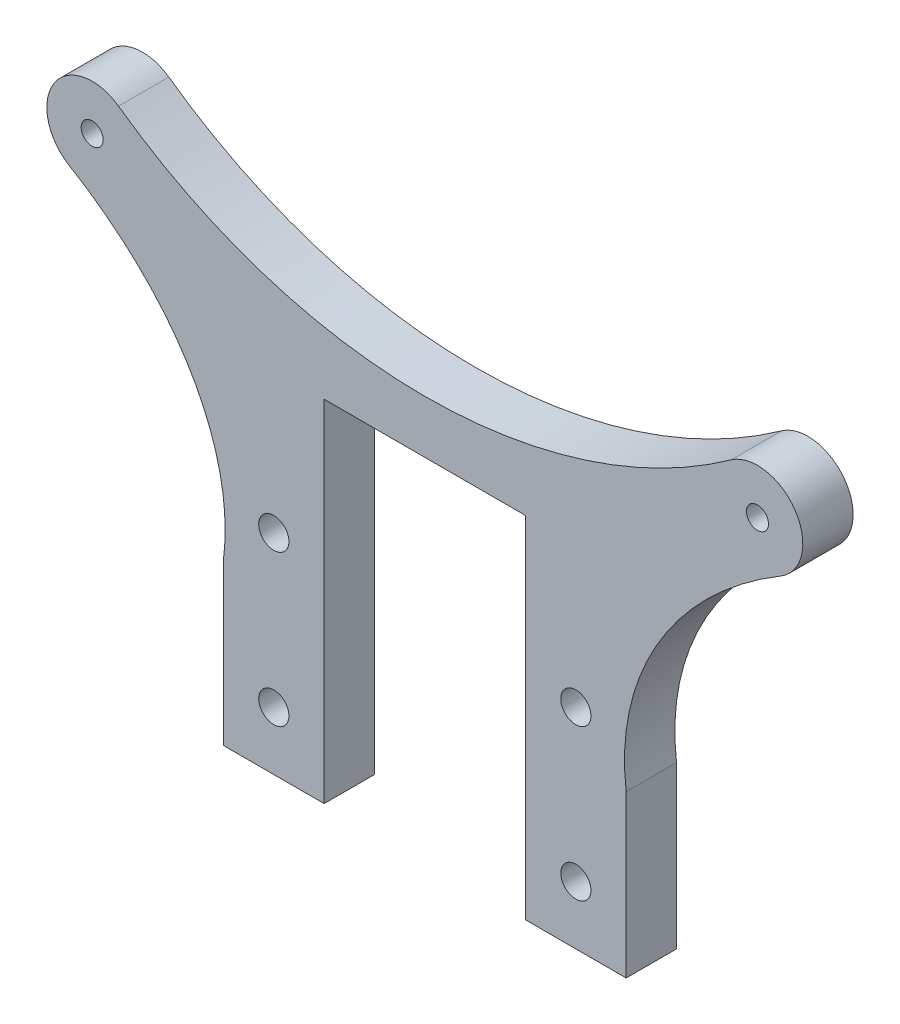
ISO-10303-21;
HEADER;
FILE_DESCRIPTION(('STEP AP214'),'2;1');
FILE_NAME('part.step','',(''),(''),'','','');
FILE_SCHEMA(('AUTOMOTIVE_DESIGN { 1 0 10303 214 1 1 1 1 }'));
ENDSEC;
DATA;
#1=APPLICATION_CONTEXT('core data for automotive mechanical design processes');
#2=APPLICATION_PROTOCOL_DEFINITION('international standard','automotive_design',2000,#1);
#3=PRODUCT_CONTEXT('',#1,'mechanical');
#4=PRODUCT('Part','Part','',(#3));
#5=PRODUCT_RELATED_PRODUCT_CATEGORY('part','',(#4));
#6=PRODUCT_DEFINITION_FORMATION('','',#4);
#7=PRODUCT_DEFINITION_CONTEXT('part definition',#1,'design');
#8=PRODUCT_DEFINITION('design','',#6,#7);
#9=PRODUCT_DEFINITION_SHAPE('','',#8);
#10=(LENGTH_UNIT() NAMED_UNIT(*) SI_UNIT(.MILLI.,.METRE.));
#11=(NAMED_UNIT(*) PLANE_ANGLE_UNIT() SI_UNIT($,.RADIAN.));
#12=(NAMED_UNIT(*) SI_UNIT($,.STERADIAN.) SOLID_ANGLE_UNIT());
#13=UNCERTAINTY_MEASURE_WITH_UNIT(LENGTH_MEASURE(1.E-05),#10,'distance_accuracy_value','');
#14=(GEOMETRIC_REPRESENTATION_CONTEXT(3) GLOBAL_UNCERTAINTY_ASSIGNED_CONTEXT((#13)) GLOBAL_UNIT_ASSIGNED_CONTEXT((#10,
#11,#12)) REPRESENTATION_CONTEXT('',''));
#15=CARTESIAN_POINT('',(0.,0.,0.));
#16=DIRECTION('',(0.,0.,1.));
#17=DIRECTION('',(1.,0.,0.));
#18=AXIS2_PLACEMENT_3D('',#15,#16,#17);
#19=CARTESIAN_POINT('',(-73.0062863667231,-17.7906023746381,6.35));
#20=DIRECTION('',(0.,0.,-1.));
#21=DIRECTION('',(-1.,0.,0.));
#22=AXIS2_PLACEMENT_3D('',#19,#20,#21);
#23=PLANE('',#22);
#24=CARTESIAN_POINT('',(19.05,-36.83,6.35));
#25=DIRECTION('',(0.,0.,1.));
#26=DIRECTION('',(-1.,0.,0.));
#27=AXIS2_PLACEMENT_3D('',#24,#25,#26);
#28=CIRCLE('',#27,1.905);
#29=CARTESIAN_POINT('',(17.145,-36.83,6.35));
#30=VERTEX_POINT('',#29);
#31=EDGE_CURVE('E314',#30,#30,#28,.T.);
#32=ORIENTED_EDGE('',*,*,#31,.F.);
#33=EDGE_LOOP('',(#32));
#34=FACE_BOUND('',#33,.T.);
#35=CARTESIAN_POINT('',(-19.05,-17.78,6.35));
#36=DIRECTION('',(0.,0.,1.));
#37=DIRECTION('',(1.,0.,0.));
#38=AXIS2_PLACEMENT_3D('',#35,#36,#37);
#39=CIRCLE('',#38,1.905);
#40=CARTESIAN_POINT('',(-17.145,-17.78,6.35));
#41=VERTEX_POINT('',#40);
#42=EDGE_CURVE('E302',#41,#41,#39,.T.);
#43=ORIENTED_EDGE('',*,*,#42,.F.);
#44=EDGE_LOOP('',(#43));
#45=FACE_BOUND('',#44,.T.);
#46=CARTESIAN_POINT('',(-41.9643005243721,14.3937584378365,6.35));
#47=DIRECTION('',(0.,0.,1.));
#48=DIRECTION('',(1.,0.,0.));
#49=AXIS2_PLACEMENT_3D('',#46,#47,#48);
#50=CIRCLE('',#49,1.3890625);
#51=CARTESIAN_POINT('',(-40.5752380243721,14.3937584378365,6.35));
#52=VERTEX_POINT('',#51);
#53=EDGE_CURVE('E158',#52,#52,#50,.T.);
#54=ORIENTED_EDGE('',*,*,#53,.F.);
#55=EDGE_LOOP('',(#54));
#56=FACE_BOUND('',#55,.T.);
#57=DIRECTION('',(0.,1.,0.));
#58=VECTOR('',#57,1.);
#59=CARTESIAN_POINT('',(-12.7,0.,6.35));
#60=LINE('',#59,#58);
#61=CARTESIAN_POINT('',(-12.7,-44.1799362896269,6.35));
#62=VERTEX_POINT('',#61);
#63=CARTESIAN_POINT('',(-12.7,0.,6.35));
#64=VERTEX_POINT('',#63);
#65=EDGE_CURVE('E177',#62,#64,#60,.T.);
#66=ORIENTED_EDGE('',*,*,#65,.T.);
#67=DIRECTION('',(1.,0.,0.));
#68=VECTOR('',#67,1.);
#69=CARTESIAN_POINT('',(-12.7,0.,6.35));
#70=LINE('',#69,#68);
#71=CARTESIAN_POINT('',(12.7,0.,6.35));
#72=VERTEX_POINT('',#71);
#73=EDGE_CURVE('E104',#64,#72,#70,.T.);
#74=ORIENTED_EDGE('',*,*,#73,.T.);
#75=DIRECTION('',(0.,-1.,0.));
#76=VECTOR('',#75,1.);
#77=CARTESIAN_POINT('',(12.7,0.,6.35));
#78=LINE('',#77,#76);
#79=CARTESIAN_POINT('',(12.7,-44.1799362896269,6.35));
#80=VERTEX_POINT('',#79);
#81=EDGE_CURVE('E204',#72,#80,#78,.T.);
#82=ORIENTED_EDGE('',*,*,#81,.T.);
#83=DIRECTION('',(1.,0.,0.));
#84=VECTOR('',#83,1.);
#85=CARTESIAN_POINT('',(25.4,-44.1799362896269,6.35));
#86=LINE('',#85,#84);
#87=CARTESIAN_POINT('',(25.4,-44.1799362896269,6.35));
#88=VERTEX_POINT('',#87);
#89=EDGE_CURVE('E223',#80,#88,#86,.T.);
#90=ORIENTED_EDGE('',*,*,#89,.T.);
#91=DIRECTION('',(0.,1.,0.));
#92=VECTOR('',#91,1.);
#93=CARTESIAN_POINT('',(25.3999999999999,-23.8229548190026,6.35));
#94=LINE('',#93,#92);
#95=CARTESIAN_POINT('',(25.3999999999999,-23.8229548190026,6.35));
#96=VERTEX_POINT('',#95);
#97=EDGE_CURVE('E220',#88,#96,#94,.T.);
#98=ORIENTED_EDGE('',*,*,#97,.T.);
#99=CARTESIAN_POINT('',(73.0062863667231,-17.7906023746381,6.35));
#100=DIRECTION('',(0.,0.,-1.));
#101=DIRECTION('',(-0.992067263205997,-0.125708175052231,0.));
#102=AXIS2_PLACEMENT_3D('',#99,#100,#101);
#103=ELLIPSE('',#102,47.9869542442889,35.5581891721506);
#104=CARTESIAN_POINT('',(44.9018705615294,9.48833089018002,6.35));
#105=VERTEX_POINT('',#104);
#106=EDGE_CURVE('E222',#96,#105,#103,.T.);
#107=ORIENTED_EDGE('',*,*,#106,.T.);
#108=CARTESIAN_POINT('',(41.9643005243721,14.3937584378365,6.35));
#109=DIRECTION('',(0.,0.,1.));
#110=DIRECTION('',(-1.,0.,0.));
#111=AXIS2_PLACEMENT_3D('',#108,#109,#110);
#112=CIRCLE('',#111,5.71773881429644);
#113=CARTESIAN_POINT('',(38.641141334679,19.0466231627635,6.35));
#114=VERTEX_POINT('',#113);
#115=EDGE_CURVE('E225',#105,#114,#112,.T.);
#116=ORIENTED_EDGE('',*,*,#115,.T.);
#117=CARTESIAN_POINT('',(-5.66387214906428E-13,73.1493588982882,6.35));
#118=DIRECTION('',(0.,0.,-1.));
#119=DIRECTION('',(-1.,0.,0.));
#120=AXIS2_PLACEMENT_3D('',#117,#118,#119);
#121=CIRCLE('',#120,66.4849142115311);
#122=CARTESIAN_POINT('',(-38.6411413346791,19.0466231627632,6.35));
#123=VERTEX_POINT('',#122);
#124=EDGE_CURVE('E486',#114,#123,#121,.T.);
#125=ORIENTED_EDGE('',*,*,#124,.T.);
#126=CARTESIAN_POINT('',(-41.9643005243721,14.3937584378365,6.35));
#127=DIRECTION('',(0.,0.,1.));
#128=DIRECTION('',(1.,0.,0.));
#129=AXIS2_PLACEMENT_3D('',#126,#127,#128);
#130=CIRCLE('',#129,5.71773881429644);
#131=CARTESIAN_POINT('',(-44.9018705615295,9.48833089017997,6.35));
#132=VERTEX_POINT('',#131);
#133=EDGE_CURVE('E135',#123,#132,#130,.T.);
#134=ORIENTED_EDGE('',*,*,#133,.T.);
#135=CARTESIAN_POINT('',(-73.0062863667231,-17.7906023746381,6.35));
#136=DIRECTION('',(0.,0.,-1.));
#137=DIRECTION('',(0.992067263205997,-0.125708175052232,0.));
#138=AXIS2_PLACEMENT_3D('',#135,#136,#137);
#139=ELLIPSE('',#138,47.9869542442889,35.5581891721506);
#140=CARTESIAN_POINT('',(-25.3999999999999,-23.8229548190026,6.35));
#141=VERTEX_POINT('',#140);
#142=EDGE_CURVE('E129',#132,#141,#139,.T.);
#143=ORIENTED_EDGE('',*,*,#142,.T.);
#144=DIRECTION('',(0.,-1.,0.));
#145=VECTOR('',#144,1.);
#146=CARTESIAN_POINT('',(-25.3999999999999,-23.8229548190026,6.35));
#147=LINE('',#146,#145);
#148=CARTESIAN_POINT('',(-25.4,-44.1799362896269,6.35));
#149=VERTEX_POINT('',#148);
#150=EDGE_CURVE('E133',#141,#149,#147,.T.);
#151=ORIENTED_EDGE('',*,*,#150,.T.);
#152=DIRECTION('',(1.,0.,0.));
#153=VECTOR('',#152,1.);
#154=CARTESIAN_POINT('',(-25.4,-44.1799362896269,6.35));
#155=LINE('',#154,#153);
#156=EDGE_CURVE('E49',#149,#62,#155,.T.);
#157=ORIENTED_EDGE('',*,*,#156,.T.);
#158=EDGE_LOOP('',(#66,#74,#82,#90,#98,#107,#116,#125,#134,#143,#151,#157));
#159=FACE_BOUND('',#158,.T.);
#160=CARTESIAN_POINT('',(41.9643005243721,14.3937584378365,6.35));
#161=DIRECTION('',(0.,0.,1.));
#162=DIRECTION('',(-1.,0.,0.));
#163=AXIS2_PLACEMENT_3D('',#160,#161,#162);
#164=CIRCLE('',#163,1.3890625);
#165=CARTESIAN_POINT('',(40.5752380243721,14.3937584378365,6.35));
#166=VERTEX_POINT('',#165);
#167=EDGE_CURVE('E296',#166,#166,#164,.T.);
#168=ORIENTED_EDGE('',*,*,#167,.F.);
#169=EDGE_LOOP('',(#168));
#170=FACE_BOUND('',#169,.T.);
#171=CARTESIAN_POINT('',(-19.05,-36.83,6.35));
#172=DIRECTION('',(0.,0.,1.));
#173=DIRECTION('',(1.,0.,0.));
#174=AXIS2_PLACEMENT_3D('',#171,#172,#173);
#175=CIRCLE('',#174,1.905);
#176=CARTESIAN_POINT('',(-17.145,-36.83,6.35));
#177=VERTEX_POINT('',#176);
#178=EDGE_CURVE('E308',#177,#177,#175,.T.);
#179=ORIENTED_EDGE('',*,*,#178,.F.);
#180=EDGE_LOOP('',(#179));
#181=FACE_BOUND('',#180,.T.);
#182=CARTESIAN_POINT('',(19.05,-17.78,6.35));
#183=DIRECTION('',(0.,0.,1.));
#184=DIRECTION('',(-1.,0.,0.));
#185=AXIS2_PLACEMENT_3D('',#182,#183,#184);
#186=CIRCLE('',#185,1.905);
#187=CARTESIAN_POINT('',(17.145,-17.78,6.35));
#188=VERTEX_POINT('',#187);
#189=EDGE_CURVE('E320',#188,#188,#186,.T.);
#190=ORIENTED_EDGE('',*,*,#189,.F.);
#191=EDGE_LOOP('',(#190));
#192=FACE_BOUND('',#191,.T.);
#193=ADVANCED_FACE('F32',(#34,#45,#56,#159,#170,#181,#192),#23,.F.);
#194=CARTESIAN_POINT('',(-73.0062863667231,-17.7906023746381,0.));
#195=DIRECTION('',(0.,0.,-1.));
#196=DIRECTION('',(-1.,0.,0.));
#197=AXIS2_PLACEMENT_3D('',#194,#195,#196);
#198=PLANE('',#197);
#199=CARTESIAN_POINT('',(19.05,-36.83,0.));
#200=DIRECTION('',(0.,0.,1.));
#201=DIRECTION('',(-1.,0.,0.));
#202=AXIS2_PLACEMENT_3D('',#199,#200,#201);
#203=CIRCLE('',#202,1.905);
#204=CARTESIAN_POINT('',(17.145,-36.83,0.));
#205=VERTEX_POINT('',#204);
#206=EDGE_CURVE('E317',#205,#205,#203,.T.);
#207=ORIENTED_EDGE('',*,*,#206,.T.);
#208=EDGE_LOOP('',(#207));
#209=FACE_BOUND('',#208,.T.);
#210=CARTESIAN_POINT('',(-19.05,-17.78,0.));
#211=DIRECTION('',(0.,0.,1.));
#212=DIRECTION('',(1.,0.,0.));
#213=AXIS2_PLACEMENT_3D('',#210,#211,#212);
#214=CIRCLE('',#213,1.905);
#215=CARTESIAN_POINT('',(-17.145,-17.78,0.));
#216=VERTEX_POINT('',#215);
#217=EDGE_CURVE('E305',#216,#216,#214,.T.);
#218=ORIENTED_EDGE('',*,*,#217,.T.);
#219=EDGE_LOOP('',(#218));
#220=FACE_BOUND('',#219,.T.);
#221=CARTESIAN_POINT('',(-41.9643005243721,14.3937584378365,0.));
#222=DIRECTION('',(0.,0.,1.));
#223=DIRECTION('',(1.,0.,0.));
#224=AXIS2_PLACEMENT_3D('',#221,#222,#223);
#225=CIRCLE('',#224,1.3890625);
#226=CARTESIAN_POINT('',(-40.5752380243721,14.3937584378365,0.));
#227=VERTEX_POINT('',#226);
#228=EDGE_CURVE('E293',#227,#227,#225,.T.);
#229=ORIENTED_EDGE('',*,*,#228,.T.);
#230=EDGE_LOOP('',(#229));
#231=FACE_BOUND('',#230,.T.);
#232=DIRECTION('',(0.,1.,0.));
#233=VECTOR('',#232,1.);
#234=CARTESIAN_POINT('',(-12.7,0.,0.));
#235=LINE('',#234,#233);
#236=CARTESIAN_POINT('',(-12.7,-44.1799362896269,0.));
#237=VERTEX_POINT('',#236);
#238=CARTESIAN_POINT('',(-12.7,0.,0.));
#239=VERTEX_POINT('',#238);
#240=EDGE_CURVE('E154',#237,#239,#235,.T.);
#241=ORIENTED_EDGE('',*,*,#240,.F.);
#242=DIRECTION('',(1.,0.,0.));
#243=VECTOR('',#242,1.);
#244=CARTESIAN_POINT('',(-25.4,-44.1799362896269,0.));
#245=LINE('',#244,#243);
#246=CARTESIAN_POINT('',(-25.4,-44.1799362896269,0.));
#247=VERTEX_POINT('',#246);
#248=EDGE_CURVE('E96',#247,#237,#245,.T.);
#249=ORIENTED_EDGE('',*,*,#248,.F.);
#250=DIRECTION('',(0.,-1.,0.));
#251=VECTOR('',#250,1.);
#252=CARTESIAN_POINT('',(-25.3999999999999,-23.8229548190026,0.));
#253=LINE('',#252,#251);
#254=CARTESIAN_POINT('',(-25.3999999999999,-23.8229548190026,0.));
#255=VERTEX_POINT('',#254);
#256=EDGE_CURVE('E90',#255,#247,#253,.T.);
#257=ORIENTED_EDGE('',*,*,#256,.F.);
#258=CARTESIAN_POINT('',(-73.0062863667231,-17.7906023746381,0.));
#259=DIRECTION('',(0.,0.,-1.));
#260=DIRECTION('',(0.992067263205997,-0.125708175052232,0.));
#261=AXIS2_PLACEMENT_3D('',#258,#259,#260);
#262=ELLIPSE('',#261,47.9869542442889,35.5581891721506);
#263=CARTESIAN_POINT('',(-44.9018705615295,9.48833089017997,0.));
#264=VERTEX_POINT('',#263);
#265=EDGE_CURVE('E143',#264,#255,#262,.T.);
#266=ORIENTED_EDGE('',*,*,#265,.F.);
#267=CARTESIAN_POINT('',(-41.9643005243721,14.3937584378365,0.));
#268=DIRECTION('',(0.,0.,1.));
#269=DIRECTION('',(1.,0.,0.));
#270=AXIS2_PLACEMENT_3D('',#267,#268,#269);
#271=CIRCLE('',#270,5.71773881429644);
#272=CARTESIAN_POINT('',(-38.6411413346791,19.0466231627632,0.));
#273=VERTEX_POINT('',#272);
#274=EDGE_CURVE('E172',#273,#264,#271,.T.);
#275=ORIENTED_EDGE('',*,*,#274,.F.);
#276=CARTESIAN_POINT('',(-5.66387214906428E-13,73.1493588982882,0.));
#277=DIRECTION('',(0.,0.,-1.));
#278=DIRECTION('',(-1.,0.,0.));
#279=AXIS2_PLACEMENT_3D('',#276,#277,#278);
#280=CIRCLE('',#279,66.4849142115311);
#281=CARTESIAN_POINT('',(38.641141334679,19.0466231627635,0.));
#282=VERTEX_POINT('',#281);
#283=EDGE_CURVE('E170',#282,#273,#280,.T.);
#284=ORIENTED_EDGE('',*,*,#283,.F.);
#285=CARTESIAN_POINT('',(41.9643005243721,14.3937584378365,0.));
#286=DIRECTION('',(0.,0.,1.));
#287=DIRECTION('',(-1.,0.,0.));
#288=AXIS2_PLACEMENT_3D('',#285,#286,#287);
#289=CIRCLE('',#288,5.71773881429644);
#290=CARTESIAN_POINT('',(44.9018705615294,9.48833089018002,0.));
#291=VERTEX_POINT('',#290);
#292=EDGE_CURVE('E168',#291,#282,#289,.T.);
#293=ORIENTED_EDGE('',*,*,#292,.F.);
#294=CARTESIAN_POINT('',(73.0062863667231,-17.7906023746381,0.));
#295=DIRECTION('',(0.,0.,-1.));
#296=DIRECTION('',(-0.992067263205997,-0.125708175052231,0.));
#297=AXIS2_PLACEMENT_3D('',#294,#295,#296);
#298=ELLIPSE('',#297,47.9869542442889,35.5581891721506);
#299=CARTESIAN_POINT('',(25.3999999999999,-23.8229548190026,0.));
#300=VERTEX_POINT('',#299);
#301=EDGE_CURVE('E166',#300,#291,#298,.T.);
#302=ORIENTED_EDGE('',*,*,#301,.F.);
#303=DIRECTION('',(0.,1.,0.));
#304=VECTOR('',#303,1.);
#305=CARTESIAN_POINT('',(25.3999999999999,-23.8229548190026,0.));
#306=LINE('',#305,#304);
#307=CARTESIAN_POINT('',(25.4,-44.1799362896269,0.));
#308=VERTEX_POINT('',#307);
#309=EDGE_CURVE('E164',#308,#300,#306,.T.);
#310=ORIENTED_EDGE('',*,*,#309,.F.);
#311=DIRECTION('',(1.,0.,0.));
#312=VECTOR('',#311,1.);
#313=CARTESIAN_POINT('',(25.4,-44.1799362896269,0.));
#314=LINE('',#313,#312);
#315=CARTESIAN_POINT('',(12.7,-44.1799362896269,0.));
#316=VERTEX_POINT('',#315);
#317=EDGE_CURVE('E162',#316,#308,#314,.T.);
#318=ORIENTED_EDGE('',*,*,#317,.F.);
#319=DIRECTION('',(0.,-1.,0.));
#320=VECTOR('',#319,1.);
#321=CARTESIAN_POINT('',(12.7,0.,0.));
#322=LINE('',#321,#320);
#323=CARTESIAN_POINT('',(12.7,0.,0.));
#324=VERTEX_POINT('',#323);
#325=EDGE_CURVE('E160',#324,#316,#322,.T.);
#326=ORIENTED_EDGE('',*,*,#325,.F.);
#327=DIRECTION('',(1.,0.,0.));
#328=VECTOR('',#327,1.);
#329=CARTESIAN_POINT('',(-12.7,0.,0.));
#330=LINE('',#329,#328);
#331=EDGE_CURVE('E157',#239,#324,#330,.T.);
#332=ORIENTED_EDGE('',*,*,#331,.F.);
#333=EDGE_LOOP('',(#241,#249,#257,#266,#275,#284,#293,#302,#310,#318,#326,#332));
#334=FACE_BOUND('',#333,.T.);
#335=CARTESIAN_POINT('',(41.9643005243721,14.3937584378365,0.));
#336=DIRECTION('',(0.,0.,1.));
#337=DIRECTION('',(-1.,0.,0.));
#338=AXIS2_PLACEMENT_3D('',#335,#336,#337);
#339=CIRCLE('',#338,1.3890625);
#340=CARTESIAN_POINT('',(40.5752380243721,14.3937584378365,0.));
#341=VERTEX_POINT('',#340);
#342=EDGE_CURVE('E299',#341,#341,#339,.T.);
#343=ORIENTED_EDGE('',*,*,#342,.T.);
#344=EDGE_LOOP('',(#343));
#345=FACE_BOUND('',#344,.T.);
#346=CARTESIAN_POINT('',(-19.05,-36.83,0.));
#347=DIRECTION('',(0.,0.,1.));
#348=DIRECTION('',(1.,0.,0.));
#349=AXIS2_PLACEMENT_3D('',#346,#347,#348);
#350=CIRCLE('',#349,1.905);
#351=CARTESIAN_POINT('',(-17.145,-36.83,0.));
#352=VERTEX_POINT('',#351);
#353=EDGE_CURVE('E311',#352,#352,#350,.T.);
#354=ORIENTED_EDGE('',*,*,#353,.T.);
#355=EDGE_LOOP('',(#354));
#356=FACE_BOUND('',#355,.T.);
#357=CARTESIAN_POINT('',(19.05,-17.78,0.));
#358=DIRECTION('',(0.,0.,1.));
#359=DIRECTION('',(-1.,0.,0.));
#360=AXIS2_PLACEMENT_3D('',#357,#358,#359);
#361=CIRCLE('',#360,1.905);
#362=CARTESIAN_POINT('',(17.145,-17.78,0.));
#363=VERTEX_POINT('',#362);
#364=EDGE_CURVE('E323',#363,#363,#361,.T.);
#365=ORIENTED_EDGE('',*,*,#364,.T.);
#366=EDGE_LOOP('',(#365));
#367=FACE_BOUND('',#366,.T.);
#368=ADVANCED_FACE('F208',(#209,#220,#231,#334,#345,#356,#367),#198,.T.);
#369=CARTESIAN_POINT('',(-12.7,0.,6.35));
#370=DIRECTION('',(-1.,0.,0.));
#371=DIRECTION('',(0.,0.,1.));
#372=AXIS2_PLACEMENT_3D('',#369,#370,#371);
#373=PLANE('',#372);
#374=ORIENTED_EDGE('',*,*,#240,.T.);
#375=DIRECTION('',(0.,0.,-1.));
#376=VECTOR('',#375,1.);
#377=CARTESIAN_POINT('',(-12.7,0.,6.35));
#378=LINE('',#377,#376);
#379=EDGE_CURVE('E11',#64,#239,#378,.T.);
#380=ORIENTED_EDGE('',*,*,#379,.F.);
#381=ORIENTED_EDGE('',*,*,#65,.F.);
#382=DIRECTION('',(0.,0.,-1.));
#383=VECTOR('',#382,1.);
#384=CARTESIAN_POINT('',(-12.7,-44.1799362896269,6.35));
#385=LINE('',#384,#383);
#386=EDGE_CURVE('E149',#62,#237,#385,.T.);
#387=ORIENTED_EDGE('',*,*,#386,.T.);
#388=EDGE_LOOP('',(#374,#380,#381,#387));
#389=FACE_BOUND('',#388,.T.);
#390=ADVANCED_FACE('F34',(#389),#373,.F.);
#391=CARTESIAN_POINT('',(-12.7,0.,6.35));
#392=DIRECTION('',(0.,1.,0.));
#393=DIRECTION('',(-1.,0.,0.));
#394=AXIS2_PLACEMENT_3D('',#391,#392,#393);
#395=PLANE('',#394);
#396=ORIENTED_EDGE('',*,*,#331,.T.);
#397=DIRECTION('',(0.,0.,-1.));
#398=VECTOR('',#397,1.);
#399=CARTESIAN_POINT('',(12.7,0.,6.35));
#400=LINE('',#399,#398);
#401=EDGE_CURVE('E41',#72,#324,#400,.T.);
#402=ORIENTED_EDGE('',*,*,#401,.F.);
#403=ORIENTED_EDGE('',*,*,#73,.F.);
#404=ORIENTED_EDGE('',*,*,#379,.T.);
#405=EDGE_LOOP('',(#396,#402,#403,#404));
#406=FACE_BOUND('',#405,.T.);
#407=ADVANCED_FACE('F245',(#406),#395,.F.);
#408=CARTESIAN_POINT('',(12.7,0.,6.35));
#409=DIRECTION('',(1.,0.,0.));
#410=DIRECTION('',(0.,1.,0.));
#411=AXIS2_PLACEMENT_3D('',#408,#409,#410);
#412=PLANE('',#411);
#413=ORIENTED_EDGE('',*,*,#325,.T.);
#414=DIRECTION('',(0.,0.,-1.));
#415=VECTOR('',#414,1.);
#416=CARTESIAN_POINT('',(12.7,-44.1799362896269,6.35));
#417=LINE('',#416,#415);
#418=EDGE_CURVE('E196',#80,#316,#417,.T.);
#419=ORIENTED_EDGE('',*,*,#418,.F.);
#420=ORIENTED_EDGE('',*,*,#81,.F.);
#421=ORIENTED_EDGE('',*,*,#401,.T.);
#422=EDGE_LOOP('',(#413,#419,#420,#421));
#423=FACE_BOUND('',#422,.T.);
#424=ADVANCED_FACE('F202',(#423),#412,.F.);
#425=CARTESIAN_POINT('',(25.4,-44.1799362896269,6.35));
#426=DIRECTION('',(0.,1.,0.));
#427=DIRECTION('',(-1.,0.,0.));
#428=AXIS2_PLACEMENT_3D('',#425,#426,#427);
#429=PLANE('',#428);
#430=ORIENTED_EDGE('',*,*,#317,.T.);
#431=DIRECTION('',(0.,0.,-1.));
#432=VECTOR('',#431,1.);
#433=CARTESIAN_POINT('',(25.4,-44.1799362896269,6.35));
#434=LINE('',#433,#432);
#435=EDGE_CURVE('E193',#88,#308,#434,.T.);
#436=ORIENTED_EDGE('',*,*,#435,.F.);
#437=ORIENTED_EDGE('',*,*,#89,.F.);
#438=ORIENTED_EDGE('',*,*,#418,.T.);
#439=EDGE_LOOP('',(#430,#436,#437,#438));
#440=FACE_BOUND('',#439,.T.);
#441=ADVANCED_FACE('F214',(#440),#429,.F.);
#442=CARTESIAN_POINT('',(25.3999999999999,-23.8229548190026,6.35));
#443=DIRECTION('',(-1.,0.,0.));
#444=DIRECTION('',(0.,-1.,0.));
#445=AXIS2_PLACEMENT_3D('',#442,#443,#444);
#446=PLANE('',#445);
#447=ORIENTED_EDGE('',*,*,#309,.T.);
#448=DIRECTION('',(0.,0.,-1.));
#449=VECTOR('',#448,1.);
#450=CARTESIAN_POINT('',(25.3999999999999,-23.8229548190026,6.35));
#451=LINE('',#450,#449);
#452=EDGE_CURVE('E190',#96,#300,#451,.T.);
#453=ORIENTED_EDGE('',*,*,#452,.F.);
#454=ORIENTED_EDGE('',*,*,#97,.F.);
#455=ORIENTED_EDGE('',*,*,#435,.T.);
#456=EDGE_LOOP('',(#447,#453,#454,#455));
#457=FACE_BOUND('',#456,.T.);
#458=ADVANCED_FACE('F218',(#457),#446,.F.);
#459=DIRECTION('',(0.,0.,-1.));
#460=VECTOR('',#459,1.);
#461=SURFACE_OF_LINEAR_EXTRUSION('',#103,#460);
#462=ORIENTED_EDGE('',*,*,#301,.T.);
#463=DIRECTION('',(0.,0.,-1.));
#464=VECTOR('',#463,1.);
#465=CARTESIAN_POINT('',(44.9018705615294,9.48833089018002,6.35));
#466=LINE('',#465,#464);
#467=EDGE_CURVE('E187',#105,#291,#466,.T.);
#468=ORIENTED_EDGE('',*,*,#467,.F.);
#469=ORIENTED_EDGE('',*,*,#106,.F.);
#470=ORIENTED_EDGE('',*,*,#452,.T.);
#471=EDGE_LOOP('',(#462,#468,#469,#470));
#472=FACE_BOUND('',#471,.T.);
#473=ADVANCED_FACE('F233',(#472),#461,.F.);
#474=CARTESIAN_POINT('',(41.9643005243721,14.3937584378365,6.35));
#475=DIRECTION('',(0.,0.,-1.));
#476=DIRECTION('',(-1.,0.,0.));
#477=AXIS2_PLACEMENT_3D('',#474,#475,#476);
#478=CYLINDRICAL_SURFACE('',#477,5.71773881429644);
#479=ORIENTED_EDGE('',*,*,#292,.T.);
#480=DIRECTION('',(0.,0.,-1.));
#481=VECTOR('',#480,1.);
#482=CARTESIAN_POINT('',(38.641141334679,19.0466231627635,6.35));
#483=LINE('',#482,#481);
#484=EDGE_CURVE('E184',#114,#282,#483,.T.);
#485=ORIENTED_EDGE('',*,*,#484,.F.);
#486=ORIENTED_EDGE('',*,*,#115,.F.);
#487=ORIENTED_EDGE('',*,*,#467,.T.);
#488=EDGE_LOOP('',(#479,#485,#486,#487));
#489=FACE_BOUND('',#488,.T.);
#490=ADVANCED_FACE('F237',(#489),#478,.T.);
#491=CARTESIAN_POINT('',(-5.66387214906428E-13,73.1493588982882,6.35));
#492=DIRECTION('',(0.,0.,-1.));
#493=DIRECTION('',(-1.,0.,0.));
#494=AXIS2_PLACEMENT_3D('',#491,#492,#493);
#495=CYLINDRICAL_SURFACE('',#494,66.4849142115311);
#496=ORIENTED_EDGE('',*,*,#283,.T.);
#497=DIRECTION('',(0.,0.,-1.));
#498=VECTOR('',#497,1.);
#499=CARTESIAN_POINT('',(-38.6411413346791,19.0466231627632,6.35));
#500=LINE('',#499,#498);
#501=EDGE_CURVE('E181',#123,#273,#500,.T.);
#502=ORIENTED_EDGE('',*,*,#501,.F.);
#503=ORIENTED_EDGE('',*,*,#124,.F.);
#504=ORIENTED_EDGE('',*,*,#484,.T.);
#505=EDGE_LOOP('',(#496,#502,#503,#504));
#506=FACE_BOUND('',#505,.T.);
#507=ADVANCED_FACE('F274',(#506),#495,.F.);
#508=CARTESIAN_POINT('',(-41.9643005243721,14.3937584378365,6.35));
#509=DIRECTION('',(0.,0.,-1.));
#510=DIRECTION('',(-1.,0.,0.));
#511=AXIS2_PLACEMENT_3D('',#508,#509,#510);
#512=CYLINDRICAL_SURFACE('',#511,5.71773881429644);
#513=ORIENTED_EDGE('',*,*,#274,.T.);
#514=DIRECTION('',(0.,0.,-1.));
#515=VECTOR('',#514,1.);
#516=CARTESIAN_POINT('',(-44.9018705615295,9.48833089017997,6.35));
#517=LINE('',#516,#515);
#518=EDGE_CURVE('E144',#132,#264,#517,.T.);
#519=ORIENTED_EDGE('',*,*,#518,.F.);
#520=ORIENTED_EDGE('',*,*,#133,.F.);
#521=ORIENTED_EDGE('',*,*,#501,.T.);
#522=EDGE_LOOP('',(#513,#519,#520,#521));
#523=FACE_BOUND('',#522,.T.);
#524=ADVANCED_FACE('F272',(#523),#512,.T.);
#525=DIRECTION('',(0.,0.,-1.));
#526=VECTOR('',#525,1.);
#527=SURFACE_OF_LINEAR_EXTRUSION('',#139,#526);
#528=ORIENTED_EDGE('',*,*,#265,.T.);
#529=DIRECTION('',(0.,0.,-1.));
#530=VECTOR('',#529,1.);
#531=CARTESIAN_POINT('',(-25.3999999999999,-23.8229548190026,6.35));
#532=LINE('',#531,#530);
#533=EDGE_CURVE('E140',#141,#255,#532,.T.);
#534=ORIENTED_EDGE('',*,*,#533,.F.);
#535=ORIENTED_EDGE('',*,*,#142,.F.);
#536=ORIENTED_EDGE('',*,*,#518,.T.);
#537=EDGE_LOOP('',(#528,#534,#535,#536));
#538=FACE_BOUND('',#537,.T.);
#539=ADVANCED_FACE('F141',(#538),#527,.F.);
#540=CARTESIAN_POINT('',(-25.3999999999999,-23.8229548190026,6.35));
#541=DIRECTION('',(1.,0.,0.));
#542=DIRECTION('',(0.,1.,0.));
#543=AXIS2_PLACEMENT_3D('',#540,#541,#542);
#544=PLANE('',#543);
#545=ORIENTED_EDGE('',*,*,#256,.T.);
#546=DIRECTION('',(0.,0.,-1.));
#547=VECTOR('',#546,1.);
#548=CARTESIAN_POINT('',(-25.4,-44.1799362896269,6.35));
#549=LINE('',#548,#547);
#550=EDGE_CURVE('E145',#149,#247,#549,.T.);
#551=ORIENTED_EDGE('',*,*,#550,.F.);
#552=ORIENTED_EDGE('',*,*,#150,.F.);
#553=ORIENTED_EDGE('',*,*,#533,.T.);
#554=EDGE_LOOP('',(#545,#551,#552,#553));
#555=FACE_BOUND('',#554,.T.);
#556=ADVANCED_FACE('F147',(#555),#544,.F.);
#557=CARTESIAN_POINT('',(-25.4,-44.1799362896269,6.35));
#558=DIRECTION('',(0.,1.,0.));
#559=DIRECTION('',(-1.,0.,0.));
#560=AXIS2_PLACEMENT_3D('',#557,#558,#559);
#561=PLANE('',#560);
#562=ORIENTED_EDGE('',*,*,#248,.T.);
#563=ORIENTED_EDGE('',*,*,#386,.F.);
#564=ORIENTED_EDGE('',*,*,#156,.F.);
#565=ORIENTED_EDGE('',*,*,#550,.T.);
#566=EDGE_LOOP('',(#562,#563,#564,#565));
#567=FACE_BOUND('',#566,.T.);
#568=ADVANCED_FACE('F265',(#567),#561,.F.);
#569=CARTESIAN_POINT('',(-41.9643005243721,14.3937584378365,6.35));
#570=DIRECTION('',(0.,0.,-1.));
#571=DIRECTION('',(-1.,0.,0.));
#572=AXIS2_PLACEMENT_3D('',#569,#570,#571);
#573=CYLINDRICAL_SURFACE('',#572,1.3890625);
#574=ORIENTED_EDGE('',*,*,#53,.T.);
#575=EDGE_LOOP('',(#574));
#576=FACE_BOUND('',#575,.T.);
#577=ORIENTED_EDGE('',*,*,#228,.F.);
#578=EDGE_LOOP('',(#577));
#579=FACE_BOUND('',#578,.T.);
#580=ADVANCED_FACE('F262',(#576,#579),#573,.F.);
#581=CARTESIAN_POINT('',(41.9643005243721,14.3937584378365,6.35));
#582=DIRECTION('',(0.,0.,-1.));
#583=DIRECTION('',(-1.,0.,0.));
#584=AXIS2_PLACEMENT_3D('',#581,#582,#583);
#585=CYLINDRICAL_SURFACE('',#584,1.3890625);
#586=ORIENTED_EDGE('',*,*,#167,.T.);
#587=EDGE_LOOP('',(#586));
#588=FACE_BOUND('',#587,.T.);
#589=ORIENTED_EDGE('',*,*,#342,.F.);
#590=EDGE_LOOP('',(#589));
#591=FACE_BOUND('',#590,.T.);
#592=ADVANCED_FACE('F349',(#588,#591),#585,.F.);
#593=CARTESIAN_POINT('',(-19.05,-17.78,6.35));
#594=DIRECTION('',(0.,0.,-1.));
#595=DIRECTION('',(-1.,0.,0.));
#596=AXIS2_PLACEMENT_3D('',#593,#594,#595);
#597=CYLINDRICAL_SURFACE('',#596,1.905);
#598=ORIENTED_EDGE('',*,*,#42,.T.);
#599=EDGE_LOOP('',(#598));
#600=FACE_BOUND('',#599,.T.);
#601=ORIENTED_EDGE('',*,*,#217,.F.);
#602=EDGE_LOOP('',(#601));
#603=FACE_BOUND('',#602,.T.);
#604=ADVANCED_FACE('F346',(#600,#603),#597,.F.);
#605=CARTESIAN_POINT('',(-19.05,-36.83,6.35));
#606=DIRECTION('',(0.,0.,-1.));
#607=DIRECTION('',(-1.,0.,0.));
#608=AXIS2_PLACEMENT_3D('',#605,#606,#607);
#609=CYLINDRICAL_SURFACE('',#608,1.905);
#610=ORIENTED_EDGE('',*,*,#178,.T.);
#611=EDGE_LOOP('',(#610));
#612=FACE_BOUND('',#611,.T.);
#613=ORIENTED_EDGE('',*,*,#353,.F.);
#614=EDGE_LOOP('',(#613));
#615=FACE_BOUND('',#614,.T.);
#616=ADVANCED_FACE('F340',(#612,#615),#609,.F.);
#617=CARTESIAN_POINT('',(19.05,-36.83,6.35));
#618=DIRECTION('',(0.,0.,-1.));
#619=DIRECTION('',(-1.,0.,0.));
#620=AXIS2_PLACEMENT_3D('',#617,#618,#619);
#621=CYLINDRICAL_SURFACE('',#620,1.905);
#622=ORIENTED_EDGE('',*,*,#31,.T.);
#623=EDGE_LOOP('',(#622));
#624=FACE_BOUND('',#623,.T.);
#625=ORIENTED_EDGE('',*,*,#206,.F.);
#626=EDGE_LOOP('',(#625));
#627=FACE_BOUND('',#626,.T.);
#628=ADVANCED_FACE('F333',(#624,#627),#621,.F.);
#629=CARTESIAN_POINT('',(19.05,-17.78,6.35));
#630=DIRECTION('',(0.,0.,-1.));
#631=DIRECTION('',(-1.,0.,0.));
#632=AXIS2_PLACEMENT_3D('',#629,#630,#631);
#633=CYLINDRICAL_SURFACE('',#632,1.905);
#634=ORIENTED_EDGE('',*,*,#189,.T.);
#635=EDGE_LOOP('',(#634));
#636=FACE_BOUND('',#635,.T.);
#637=ORIENTED_EDGE('',*,*,#364,.F.);
#638=EDGE_LOOP('',(#637));
#639=FACE_BOUND('',#638,.T.);
#640=ADVANCED_FACE('F329',(#636,#639),#633,.F.);
#641=CLOSED_SHELL('',(#193,#368,#390,#407,#424,#441,#458,#473,#490,#507,#524,#539,#556,#568,
#580,#592,#604,#616,#628,#640));
#642=MANIFOLD_SOLID_BREP('B2',#641);
#643=ADVANCED_BREP_SHAPE_REPRESENTATION('',(#18,#642),#14);
#644=SHAPE_DEFINITION_REPRESENTATION(#9,#643);
ENDSEC;
END-ISO-10303-21;
